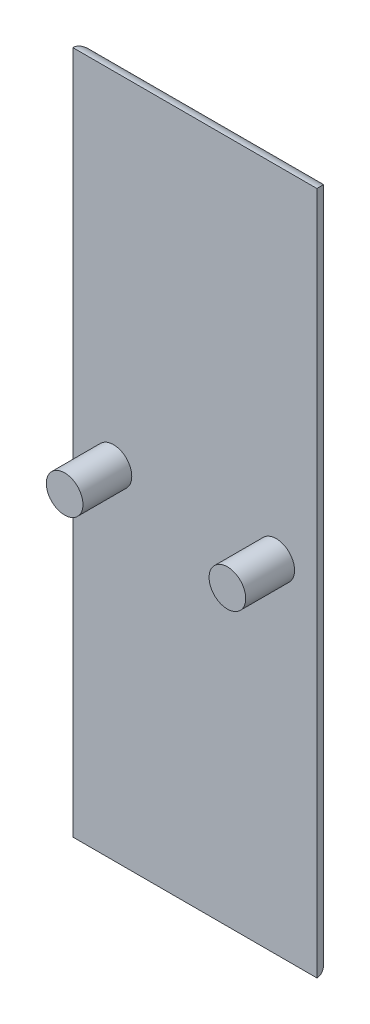
ISO-10303-21;
HEADER;
FILE_DESCRIPTION(('STEP AP214'),'2;1');
FILE_NAME('part.step','',(''),(''),'','','');
FILE_SCHEMA(('AUTOMOTIVE_DESIGN { 1 0 10303 214 1 1 1 1 }'));
ENDSEC;
DATA;
#1=APPLICATION_CONTEXT('core data for automotive mechanical design processes');
#2=APPLICATION_PROTOCOL_DEFINITION('international standard','automotive_design',2000,#1);
#3=PRODUCT_CONTEXT('',#1,'mechanical');
#4=PRODUCT('Part','Part','',(#3));
#5=PRODUCT_RELATED_PRODUCT_CATEGORY('part','',(#4));
#6=PRODUCT_DEFINITION_FORMATION('','',#4);
#7=PRODUCT_DEFINITION_CONTEXT('part definition',#1,'design');
#8=PRODUCT_DEFINITION('design','',#6,#7);
#9=PRODUCT_DEFINITION_SHAPE('','',#8);
#10=(LENGTH_UNIT() NAMED_UNIT(*) SI_UNIT(.MILLI.,.METRE.));
#11=(NAMED_UNIT(*) PLANE_ANGLE_UNIT() SI_UNIT($,.RADIAN.));
#12=(NAMED_UNIT(*) SI_UNIT($,.STERADIAN.) SOLID_ANGLE_UNIT());
#13=UNCERTAINTY_MEASURE_WITH_UNIT(LENGTH_MEASURE(1.E-05),#10,'distance_accuracy_value','');
#14=(GEOMETRIC_REPRESENTATION_CONTEXT(3) GLOBAL_UNCERTAINTY_ASSIGNED_CONTEXT((#13)) GLOBAL_UNIT_ASSIGNED_CONTEXT((#10,
#11,#12)) REPRESENTATION_CONTEXT('',''));
#15=CARTESIAN_POINT('',(0.,0.,0.));
#16=DIRECTION('',(0.,0.,1.));
#17=DIRECTION('',(1.,0.,0.));
#18=AXIS2_PLACEMENT_3D('',#15,#16,#17);
#19=CARTESIAN_POINT('',(0.,0.,2.));
#20=DIRECTION('',(0.,0.,1.));
#21=DIRECTION('',(1.,0.,0.));
#22=AXIS2_PLACEMENT_3D('',#19,#20,#21);
#23=PLANE('',#22);
#24=CARTESIAN_POINT('',(-10.,0.,2.));
#25=DIRECTION('',(0.,0.,1.));
#26=DIRECTION('',(1.,0.,0.));
#27=AXIS2_PLACEMENT_3D('',#24,#25,#26);
#28=CIRCLE('',#27,2.25);
#29=CARTESIAN_POINT('',(-7.75,0.,2.));
#30=VERTEX_POINT('',#29);
#31=EDGE_CURVE('E94',#30,#30,#28,.T.);
#32=ORIENTED_EDGE('',*,*,#31,.F.);
#33=EDGE_LOOP('',(#32));
#34=FACE_BOUND('',#33,.T.);
#35=DIRECTION('',(0.,1.,0.));
#36=VECTOR('',#35,1.);
#37=CARTESIAN_POINT('',(15.,42.,2.));
#38=LINE('',#37,#36);
#39=CARTESIAN_POINT('',(15.,-42.,2.));
#40=VERTEX_POINT('',#39);
#41=CARTESIAN_POINT('',(15.,42.,2.));
#42=VERTEX_POINT('',#41);
#43=EDGE_CURVE('E84',#40,#42,#38,.T.);
#44=ORIENTED_EDGE('',*,*,#43,.T.);
#45=DIRECTION('',(-1.,0.,0.));
#46=VECTOR('',#45,1.);
#47=CARTESIAN_POINT('',(-15.,42.,2.));
#48=LINE('',#47,#46);
#49=CARTESIAN_POINT('',(-15.,42.,2.));
#50=VERTEX_POINT('',#49);
#51=EDGE_CURVE('E88',#42,#50,#48,.T.);
#52=ORIENTED_EDGE('',*,*,#51,.T.);
#53=DIRECTION('',(0.,-1.,0.));
#54=VECTOR('',#53,1.);
#55=CARTESIAN_POINT('',(-15.,42.,2.));
#56=LINE('',#55,#54);
#57=CARTESIAN_POINT('',(-15.,-42.,2.));
#58=VERTEX_POINT('',#57);
#59=EDGE_CURVE('E107',#50,#58,#56,.T.);
#60=ORIENTED_EDGE('',*,*,#59,.T.);
#61=DIRECTION('',(1.,0.,0.));
#62=VECTOR('',#61,1.);
#63=CARTESIAN_POINT('',(-15.,-42.,2.));
#64=LINE('',#63,#62);
#65=EDGE_CURVE('E90',#58,#40,#64,.T.);
#66=ORIENTED_EDGE('',*,*,#65,.T.);
#67=EDGE_LOOP('',(#44,#52,#60,#66));
#68=FACE_BOUND('',#67,.T.);
#69=CARTESIAN_POINT('',(10.,0.,2.));
#70=DIRECTION('',(0.,0.,1.));
#71=DIRECTION('',(-1.,0.,0.));
#72=AXIS2_PLACEMENT_3D('',#69,#70,#71);
#73=CIRCLE('',#72,2.25);
#74=CARTESIAN_POINT('',(7.75,0.,2.));
#75=VERTEX_POINT('',#74);
#76=EDGE_CURVE('E125',#75,#75,#73,.T.);
#77=ORIENTED_EDGE('',*,*,#76,.F.);
#78=EDGE_LOOP('',(#77));
#79=FACE_BOUND('',#78,.T.);
#80=ADVANCED_FACE('F43',(#34,#68,#79),#23,.T.);
#81=CARTESIAN_POINT('',(0.,0.,0.));
#82=DIRECTION('',(0.,0.,1.));
#83=DIRECTION('',(1.,0.,0.));
#84=AXIS2_PLACEMENT_3D('',#81,#82,#83);
#85=PLANE('',#84);
#86=DIRECTION('',(0.,-1.,0.));
#87=VECTOR('',#86,1.);
#88=CARTESIAN_POINT('',(-13.,0.,0.));
#89=LINE('',#88,#87);
#90=CARTESIAN_POINT('',(-13.,-40.,0.));
#91=VERTEX_POINT('',#90);
#92=CARTESIAN_POINT('',(-13.,40.,0.));
#93=VERTEX_POINT('',#92);
#94=EDGE_CURVE('E52',#91,#93,#89,.F.);
#95=ORIENTED_EDGE('',*,*,#94,.T.);
#96=DIRECTION('',(-1.,0.,0.));
#97=VECTOR('',#96,1.);
#98=CARTESIAN_POINT('',(0.,40.,0.));
#99=LINE('',#98,#97);
#100=CARTESIAN_POINT('',(13.,40.,0.));
#101=VERTEX_POINT('',#100);
#102=EDGE_CURVE('E11',#93,#101,#99,.F.);
#103=ORIENTED_EDGE('',*,*,#102,.T.);
#104=DIRECTION('',(0.,1.,0.));
#105=VECTOR('',#104,1.);
#106=CARTESIAN_POINT('',(13.,0.,0.));
#107=LINE('',#106,#105);
#108=CARTESIAN_POINT('',(13.,-40.,0.));
#109=VERTEX_POINT('',#108);
#110=EDGE_CURVE('E99',#101,#109,#107,.F.);
#111=ORIENTED_EDGE('',*,*,#110,.T.);
#112=DIRECTION('',(1.,0.,0.));
#113=VECTOR('',#112,1.);
#114=CARTESIAN_POINT('',(0.,-40.,0.));
#115=LINE('',#114,#113);
#116=EDGE_CURVE('E63',#109,#91,#115,.F.);
#117=ORIENTED_EDGE('',*,*,#116,.T.);
#118=EDGE_LOOP('',(#95,#103,#111,#117));
#119=FACE_BOUND('',#118,.T.);
#120=ADVANCED_FACE('F136',(#119),#85,.F.);
#121=CARTESIAN_POINT('',(10.,0.,8.));
#122=DIRECTION('',(0.,0.,-1.));
#123=DIRECTION('',(-1.,0.,0.));
#124=AXIS2_PLACEMENT_3D('',#121,#122,#123);
#125=CYLINDRICAL_SURFACE('',#124,2.25);
#126=ORIENTED_EDGE('',*,*,#76,.T.);
#127=EDGE_LOOP('',(#126));
#128=FACE_BOUND('',#127,.T.);
#129=CARTESIAN_POINT('',(10.,0.,8.));
#130=DIRECTION('',(0.,0.,1.));
#131=DIRECTION('',(1.,0.,0.));
#132=AXIS2_PLACEMENT_3D('',#129,#130,#131);
#133=CIRCLE('',#132,2.25);
#134=CARTESIAN_POINT('',(12.25,0.,8.));
#135=VERTEX_POINT('',#134);
#136=EDGE_CURVE('E118',#135,#135,#133,.F.);
#137=ORIENTED_EDGE('',*,*,#136,.T.);
#138=EDGE_LOOP('',(#137));
#139=FACE_BOUND('',#138,.T.);
#140=ADVANCED_FACE('F142',(#128,#139),#125,.T.);
#141=CARTESIAN_POINT('',(0.,0.,8.));
#142=DIRECTION('',(0.,0.,1.));
#143=DIRECTION('',(1.,0.,0.));
#144=AXIS2_PLACEMENT_3D('',#141,#142,#143);
#145=PLANE('',#144);
#146=ORIENTED_EDGE('',*,*,#136,.F.);
#147=EDGE_LOOP('',(#146));
#148=FACE_BOUND('',#147,.T.);
#149=ADVANCED_FACE('F164',(#148),#145,.T.);
#150=CARTESIAN_POINT('',(-10.,0.,8.));
#151=DIRECTION('',(0.,0.,-1.));
#152=DIRECTION('',(-1.,0.,0.));
#153=AXIS2_PLACEMENT_3D('',#150,#151,#152);
#154=CYLINDRICAL_SURFACE('',#153,2.25);
#155=ORIENTED_EDGE('',*,*,#31,.T.);
#156=EDGE_LOOP('',(#155));
#157=FACE_BOUND('',#156,.T.);
#158=CARTESIAN_POINT('',(-10.,0.,8.));
#159=DIRECTION('',(0.,0.,1.));
#160=DIRECTION('',(1.,0.,0.));
#161=AXIS2_PLACEMENT_3D('',#158,#159,#160);
#162=CIRCLE('',#161,2.25);
#163=CARTESIAN_POINT('',(-7.75,0.,8.));
#164=VERTEX_POINT('',#163);
#165=EDGE_CURVE('E120',#164,#164,#162,.T.);
#166=ORIENTED_EDGE('',*,*,#165,.F.);
#167=EDGE_LOOP('',(#166));
#168=FACE_BOUND('',#167,.T.);
#169=ADVANCED_FACE('F132',(#157,#168),#154,.T.);
#170=CARTESIAN_POINT('',(0.,0.,8.));
#171=DIRECTION('',(0.,0.,1.));
#172=DIRECTION('',(1.,0.,0.));
#173=AXIS2_PLACEMENT_3D('',#170,#171,#172);
#174=PLANE('',#173);
#175=ORIENTED_EDGE('',*,*,#165,.T.);
#176=EDGE_LOOP('',(#175));
#177=FACE_BOUND('',#176,.T.);
#178=ADVANCED_FACE('F155',(#177),#174,.T.);
#179=CARTESIAN_POINT('',(-15.,-40.,2.));
#180=DIRECTION('',(1.,0.,0.));
#181=DIRECTION('',(0.,0.,-1.));
#182=AXIS2_PLACEMENT_3D('',#179,#180,#181);
#183=CYLINDRICAL_SURFACE('',#182,2.);
#184=CARTESIAN_POINT('',(-13.,-40.,2.));
#185=DIRECTION('',(0.707106781186547,-0.707106781186547,0.));
#186=DIRECTION('',(0.707106781186547,0.707106781186547,0.));
#187=AXIS2_PLACEMENT_3D('',#184,#185,#186);
#188=ELLIPSE('',#187,2.82842712474619,2.);
#189=EDGE_CURVE('E101',#91,#58,#188,.F.);
#190=ORIENTED_EDGE('',*,*,#189,.F.);
#191=ORIENTED_EDGE('',*,*,#116,.F.);
#192=CARTESIAN_POINT('',(13.,-40.,2.));
#193=DIRECTION('',(0.707106781186547,0.707106781186547,0.));
#194=DIRECTION('',(-0.707106781186547,0.707106781186547,0.));
#195=AXIS2_PLACEMENT_3D('',#192,#193,#194);
#196=ELLIPSE('',#195,2.82842712474619,2.);
#197=EDGE_CURVE('E47',#40,#109,#196,.T.);
#198=ORIENTED_EDGE('',*,*,#197,.F.);
#199=ORIENTED_EDGE('',*,*,#65,.F.);
#200=EDGE_LOOP('',(#190,#191,#198,#199));
#201=FACE_BOUND('',#200,.T.);
#202=ADVANCED_FACE('F45',(#201),#183,.T.);
#203=CARTESIAN_POINT('',(13.,42.,2.));
#204=DIRECTION('',(0.,1.,0.));
#205=DIRECTION('',(0.,0.,1.));
#206=AXIS2_PLACEMENT_3D('',#203,#204,#205);
#207=CYLINDRICAL_SURFACE('',#206,2.);
#208=ORIENTED_EDGE('',*,*,#197,.T.);
#209=ORIENTED_EDGE('',*,*,#110,.F.);
#210=CARTESIAN_POINT('',(13.,40.,2.));
#211=DIRECTION('',(-0.707106781186547,0.707106781186548,0.));
#212=DIRECTION('',(0.707106781186548,0.707106781186547,0.));
#213=AXIS2_PLACEMENT_3D('',#210,#211,#212);
#214=ELLIPSE('',#213,2.82842712474619,2.);
#215=EDGE_CURVE('E97',#42,#101,#214,.T.);
#216=ORIENTED_EDGE('',*,*,#215,.F.);
#217=ORIENTED_EDGE('',*,*,#43,.F.);
#218=EDGE_LOOP('',(#208,#209,#216,#217));
#219=FACE_BOUND('',#218,.T.);
#220=ADVANCED_FACE('F98',(#219),#207,.T.);
#221=CARTESIAN_POINT('',(-13.,42.,2.));
#222=DIRECTION('',(0.,-1.,0.));
#223=DIRECTION('',(0.,0.,-1.));
#224=AXIS2_PLACEMENT_3D('',#221,#222,#223);
#225=CYLINDRICAL_SURFACE('',#224,2.);
#226=ORIENTED_EDGE('',*,*,#189,.T.);
#227=ORIENTED_EDGE('',*,*,#59,.F.);
#228=CARTESIAN_POINT('',(-13.,40.,2.));
#229=DIRECTION('',(-0.707106781186548,-0.707106781186547,0.));
#230=DIRECTION('',(0.707106781186547,-0.707106781186548,0.));
#231=AXIS2_PLACEMENT_3D('',#228,#229,#230);
#232=ELLIPSE('',#231,2.82842712474619,2.);
#233=EDGE_CURVE('E102',#93,#50,#232,.F.);
#234=ORIENTED_EDGE('',*,*,#233,.F.);
#235=ORIENTED_EDGE('',*,*,#94,.F.);
#236=EDGE_LOOP('',(#226,#227,#234,#235));
#237=FACE_BOUND('',#236,.T.);
#238=ADVANCED_FACE('F149',(#237),#225,.T.);
#239=CARTESIAN_POINT('',(-15.,40.,2.));
#240=DIRECTION('',(-1.,0.,0.));
#241=DIRECTION('',(0.,-1.,0.));
#242=AXIS2_PLACEMENT_3D('',#239,#240,#241);
#243=CYLINDRICAL_SURFACE('',#242,2.);
#244=ORIENTED_EDGE('',*,*,#215,.T.);
#245=ORIENTED_EDGE('',*,*,#102,.F.);
#246=ORIENTED_EDGE('',*,*,#233,.T.);
#247=ORIENTED_EDGE('',*,*,#51,.F.);
#248=EDGE_LOOP('',(#244,#245,#246,#247));
#249=FACE_BOUND('',#248,.T.);
#250=ADVANCED_FACE('F104',(#249),#243,.T.);
#251=CLOSED_SHELL('',(#80,#120,#140,#149,#169,#178,#202,#220,#238,#250));
#252=MANIFOLD_SOLID_BREP('B2',#251);
#253=ADVANCED_BREP_SHAPE_REPRESENTATION('',(#18,#252),#14);
#254=SHAPE_DEFINITION_REPRESENTATION(#9,#253);
ENDSEC;
END-ISO-10303-21;
